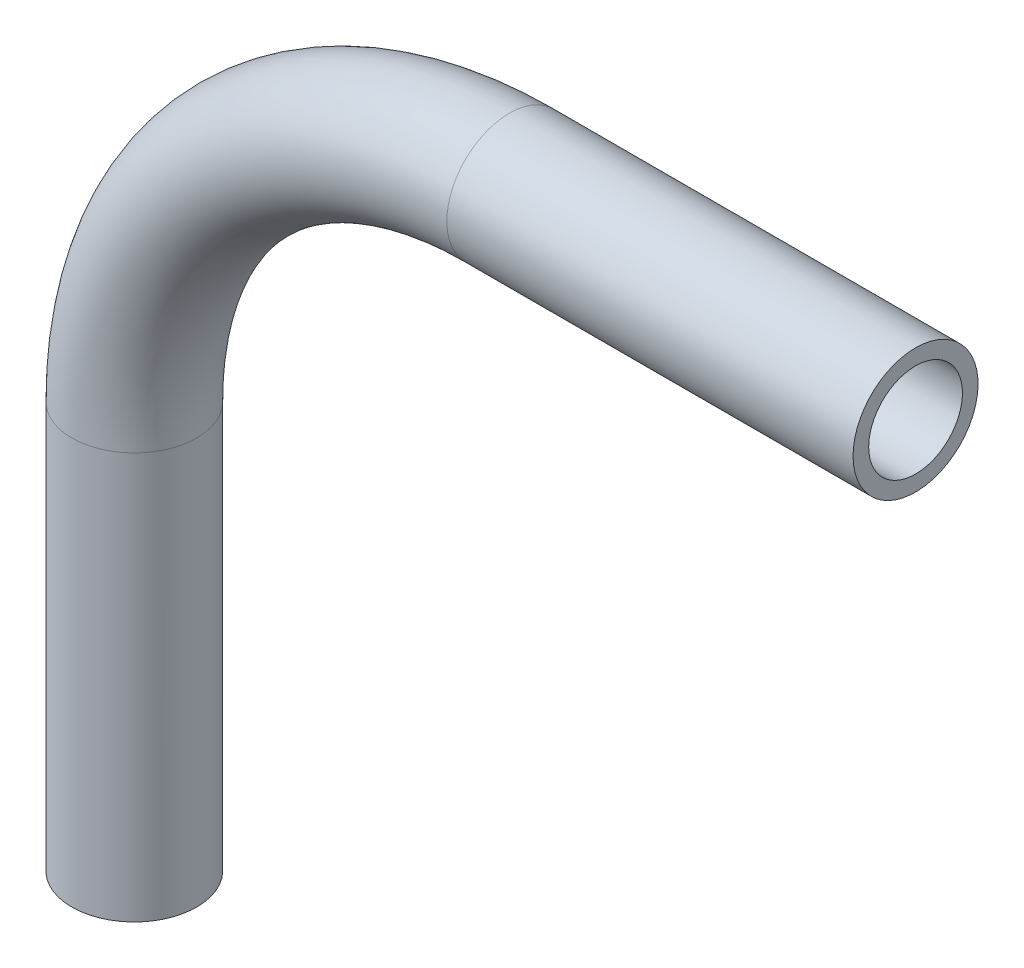
ISO-10303-21;
HEADER;
FILE_DESCRIPTION(('STEP AP214'),'2;1');
FILE_NAME('part.step','',(''),(''),'','','');
FILE_SCHEMA(('AUTOMOTIVE_DESIGN { 1 0 10303 214 1 1 1 1 }'));
ENDSEC;
DATA;
#1=APPLICATION_CONTEXT('core data for automotive mechanical design processes');
#2=APPLICATION_PROTOCOL_DEFINITION('international standard','automotive_design',2000,#1);
#3=PRODUCT_CONTEXT('',#1,'mechanical');
#4=PRODUCT('Part','Part','',(#3));
#5=PRODUCT_RELATED_PRODUCT_CATEGORY('part','',(#4));
#6=PRODUCT_DEFINITION_FORMATION('','',#4);
#7=PRODUCT_DEFINITION_CONTEXT('part definition',#1,'design');
#8=PRODUCT_DEFINITION('design','',#6,#7);
#9=PRODUCT_DEFINITION_SHAPE('','',#8);
#10=(LENGTH_UNIT() NAMED_UNIT(*) SI_UNIT(.MILLI.,.METRE.));
#11=(NAMED_UNIT(*) PLANE_ANGLE_UNIT() SI_UNIT($,.RADIAN.));
#12=(NAMED_UNIT(*) SI_UNIT($,.STERADIAN.) SOLID_ANGLE_UNIT());
#13=UNCERTAINTY_MEASURE_WITH_UNIT(LENGTH_MEASURE(1.E-05),#10,'distance_accuracy_value','');
#14=(GEOMETRIC_REPRESENTATION_CONTEXT(3) GLOBAL_UNCERTAINTY_ASSIGNED_CONTEXT((#13)) GLOBAL_UNIT_ASSIGNED_CONTEXT((#10,
#11,#12)) REPRESENTATION_CONTEXT('',''));
#15=CARTESIAN_POINT('',(0.,0.,0.));
#16=DIRECTION('',(0.,0.,1.));
#17=DIRECTION('',(1.,0.,0.));
#18=AXIS2_PLACEMENT_3D('',#15,#16,#17);
#19=CARTESIAN_POINT('',(0.,0.,0.));
#20=DIRECTION('',(0.,1.,0.));
#21=DIRECTION('',(0.,0.,1.));
#22=AXIS2_PLACEMENT_3D('',#19,#20,#21);
#23=CYLINDRICAL_SURFACE('',#22,4.);
#24=CARTESIAN_POINT('',(0.,26.,0.));
#25=DIRECTION('',(0.,1.,0.));
#26=DIRECTION('',(0.,0.,1.));
#27=AXIS2_PLACEMENT_3D('',#24,#25,#26);
#28=CIRCLE('',#27,4.);
#29=CARTESIAN_POINT('',(-4.,26.,0.));
#30=VERTEX_POINT('',#29);
#31=EDGE_CURVE('E92',#30,#30,#28,.T.);
#32=ORIENTED_EDGE('',*,*,#31,.F.);
#33=EDGE_LOOP('',(#32));
#34=FACE_BOUND('',#33,.T.);
#35=CARTESIAN_POINT('',(0.,0.,0.));
#36=DIRECTION('',(0.,1.,0.));
#37=DIRECTION('',(0.,0.,1.));
#38=AXIS2_PLACEMENT_3D('',#35,#36,#37);
#39=CIRCLE('',#38,4.);
#40=CARTESIAN_POINT('',(0.,0.,4.));
#41=VERTEX_POINT('',#40);
#42=EDGE_CURVE('E61',#41,#41,#39,.T.);
#43=ORIENTED_EDGE('',*,*,#42,.T.);
#44=EDGE_LOOP('',(#43));
#45=FACE_BOUND('',#44,.T.);
#46=ADVANCED_FACE('F46',(#34,#45),#23,.T.);
#47=CARTESIAN_POINT('',(24.,26.,0.));
#48=DIRECTION('',(0.,0.,-1.));
#49=DIRECTION('',(-1.,0.,0.));
#50=AXIS2_PLACEMENT_3D('',#47,#48,#49);
#51=TOROIDAL_SURFACE('',#50,24.,4.);
#52=CARTESIAN_POINT('',(24.,50.,0.));
#53=DIRECTION('',(1.,0.,0.));
#54=DIRECTION('',(0.,0.,1.));
#55=AXIS2_PLACEMENT_3D('',#52,#53,#54);
#56=CIRCLE('',#55,4.);
#57=CARTESIAN_POINT('',(24.,54.,0.));
#58=VERTEX_POINT('',#57);
#59=EDGE_CURVE('E50',#58,#58,#56,.T.);
#60=CARTESIAN_POINT('',(24.,26.,0.));
#61=DIRECTION('',(0.,0.,-1.));
#62=DIRECTION('',(-1.,0.,0.));
#63=AXIS2_PLACEMENT_3D('',#60,#61,#62);
#64=CIRCLE('',#63,28.);
#65=EDGE_CURVE('',#30,#58,#64,.T.);
#66=ORIENTED_EDGE('',*,*,#31,.T.);
#67=ORIENTED_EDGE('',*,*,#59,.F.);
#68=ORIENTED_EDGE('',*,*,#65,.T.);
#69=ORIENTED_EDGE('',*,*,#65,.F.);
#70=EDGE_LOOP('',(#66,#68,#67,#69));
#71=FACE_BOUND('',#70,.T.);
#72=ADVANCED_FACE('F100',(#71),#51,.T.);
#73=CARTESIAN_POINT('',(24.,50.,0.));
#74=DIRECTION('',(1.,0.,0.));
#75=DIRECTION('',(0.,1.,0.));
#76=AXIS2_PLACEMENT_3D('',#73,#74,#75);
#77=CYLINDRICAL_SURFACE('',#76,4.);
#78=CARTESIAN_POINT('',(50.,50.,0.));
#79=DIRECTION('',(1.,0.,0.));
#80=DIRECTION('',(0.,0.,1.));
#81=AXIS2_PLACEMENT_3D('',#78,#79,#80);
#82=CIRCLE('',#81,4.);
#83=CARTESIAN_POINT('',(50.,50.,4.));
#84=VERTEX_POINT('',#83);
#85=EDGE_CURVE('E66',#84,#84,#82,.T.);
#86=ORIENTED_EDGE('',*,*,#85,.F.);
#87=EDGE_LOOP('',(#86));
#88=FACE_BOUND('',#87,.T.);
#89=ORIENTED_EDGE('',*,*,#59,.T.);
#90=EDGE_LOOP('',(#89));
#91=FACE_BOUND('',#90,.T.);
#92=ADVANCED_FACE('F48',(#88,#91),#77,.T.);
#93=CARTESIAN_POINT('',(0.,0.,0.));
#94=DIRECTION('',(0.,1.,0.));
#95=DIRECTION('',(0.,0.,1.));
#96=AXIS2_PLACEMENT_3D('',#93,#94,#95);
#97=PLANE('',#96);
#98=CARTESIAN_POINT('',(0.,0.,0.));
#99=DIRECTION('',(0.,1.,0.));
#100=DIRECTION('',(0.,0.,1.));
#101=AXIS2_PLACEMENT_3D('',#98,#99,#100);
#102=CIRCLE('',#101,3.);
#103=CARTESIAN_POINT('',(0.,0.,3.));
#104=VERTEX_POINT('',#103);
#105=EDGE_CURVE('E87',#104,#104,#102,.F.);
#106=ORIENTED_EDGE('',*,*,#105,.F.);
#107=EDGE_LOOP('',(#106));
#108=FACE_BOUND('',#107,.T.);
#109=ORIENTED_EDGE('',*,*,#42,.F.);
#110=EDGE_LOOP('',(#109));
#111=FACE_BOUND('',#110,.T.);
#112=ADVANCED_FACE('F106',(#108,#111),#97,.F.);
#113=CARTESIAN_POINT('',(50.,50.,0.));
#114=DIRECTION('',(1.,0.,0.));
#115=DIRECTION('',(0.,0.,1.));
#116=AXIS2_PLACEMENT_3D('',#113,#114,#115);
#117=PLANE('',#116);
#118=CARTESIAN_POINT('',(50.,50.,0.));
#119=DIRECTION('',(1.,0.,0.));
#120=DIRECTION('',(0.,0.,1.));
#121=AXIS2_PLACEMENT_3D('',#118,#119,#120);
#122=CIRCLE('',#121,3.);
#123=CARTESIAN_POINT('',(50.,50.,3.));
#124=VERTEX_POINT('',#123);
#125=EDGE_CURVE('E13',#124,#124,#122,.F.);
#126=ORIENTED_EDGE('',*,*,#125,.T.);
#127=EDGE_LOOP('',(#126));
#128=FACE_BOUND('',#127,.T.);
#129=ORIENTED_EDGE('',*,*,#85,.T.);
#130=EDGE_LOOP('',(#129));
#131=FACE_BOUND('',#130,.T.);
#132=ADVANCED_FACE('F73',(#128,#131),#117,.T.);
#133=CARTESIAN_POINT('',(0.,0.,0.));
#134=DIRECTION('',(0.,1.,0.));
#135=DIRECTION('',(0.,0.,1.));
#136=AXIS2_PLACEMENT_3D('',#133,#134,#135);
#137=CYLINDRICAL_SURFACE('',#136,3.);
#138=CARTESIAN_POINT('',(0.,26.,0.));
#139=DIRECTION('',(0.,1.,0.));
#140=DIRECTION('',(0.,0.,1.));
#141=AXIS2_PLACEMENT_3D('',#138,#139,#140);
#142=CIRCLE('',#141,3.);
#143=CARTESIAN_POINT('',(-3.,26.,0.));
#144=VERTEX_POINT('',#143);
#145=EDGE_CURVE('E84',#144,#144,#142,.F.);
#146=ORIENTED_EDGE('',*,*,#145,.F.);
#147=EDGE_LOOP('',(#146));
#148=FACE_BOUND('',#147,.T.);
#149=ORIENTED_EDGE('',*,*,#105,.T.);
#150=EDGE_LOOP('',(#149));
#151=FACE_BOUND('',#150,.T.);
#152=ADVANCED_FACE('F114',(#148,#151),#137,.F.);
#153=CARTESIAN_POINT('',(24.,26.,0.));
#154=DIRECTION('',(0.,0.,-1.));
#155=DIRECTION('',(-1.,0.,0.));
#156=AXIS2_PLACEMENT_3D('',#153,#154,#155);
#157=TOROIDAL_SURFACE('',#156,24.,3.);
#158=CARTESIAN_POINT('',(24.,50.,0.));
#159=DIRECTION('',(1.,0.,0.));
#160=DIRECTION('',(0.,0.,1.));
#161=AXIS2_PLACEMENT_3D('',#158,#159,#160);
#162=CIRCLE('',#161,3.);
#163=CARTESIAN_POINT('',(24.,53.,0.));
#164=VERTEX_POINT('',#163);
#165=EDGE_CURVE('E55',#164,#164,#162,.F.);
#166=CARTESIAN_POINT('',(24.,26.,0.));
#167=DIRECTION('',(0.,0.,-1.));
#168=DIRECTION('',(-1.,0.,0.));
#169=AXIS2_PLACEMENT_3D('',#166,#167,#168);
#170=CIRCLE('',#169,27.);
#171=EDGE_CURVE('',#144,#164,#170,.T.);
#172=ORIENTED_EDGE('',*,*,#145,.T.);
#173=ORIENTED_EDGE('',*,*,#165,.F.);
#174=ORIENTED_EDGE('',*,*,#171,.T.);
#175=ORIENTED_EDGE('',*,*,#171,.F.);
#176=EDGE_LOOP('',(#172,#174,#173,#175));
#177=FACE_BOUND('',#176,.T.);
#178=ADVANCED_FACE('F79',(#177),#157,.F.);
#179=CARTESIAN_POINT('',(24.,50.,0.));
#180=DIRECTION('',(1.,0.,0.));
#181=DIRECTION('',(0.,1.,0.));
#182=AXIS2_PLACEMENT_3D('',#179,#180,#181);
#183=CYLINDRICAL_SURFACE('',#182,3.);
#184=ORIENTED_EDGE('',*,*,#125,.F.);
#185=EDGE_LOOP('',(#184));
#186=FACE_BOUND('',#185,.T.);
#187=ORIENTED_EDGE('',*,*,#165,.T.);
#188=EDGE_LOOP('',(#187));
#189=FACE_BOUND('',#188,.T.);
#190=ADVANCED_FACE('F76',(#186,#189),#183,.F.);
#191=CLOSED_SHELL('',(#46,#72,#92,#112,#132,#152,#178,#190));
#192=MANIFOLD_SOLID_BREP('B2',#191);
#193=ADVANCED_BREP_SHAPE_REPRESENTATION('',(#18,#192),#14);
#194=SHAPE_DEFINITION_REPRESENTATION(#9,#193);
ENDSEC;
END-ISO-10303-21;
